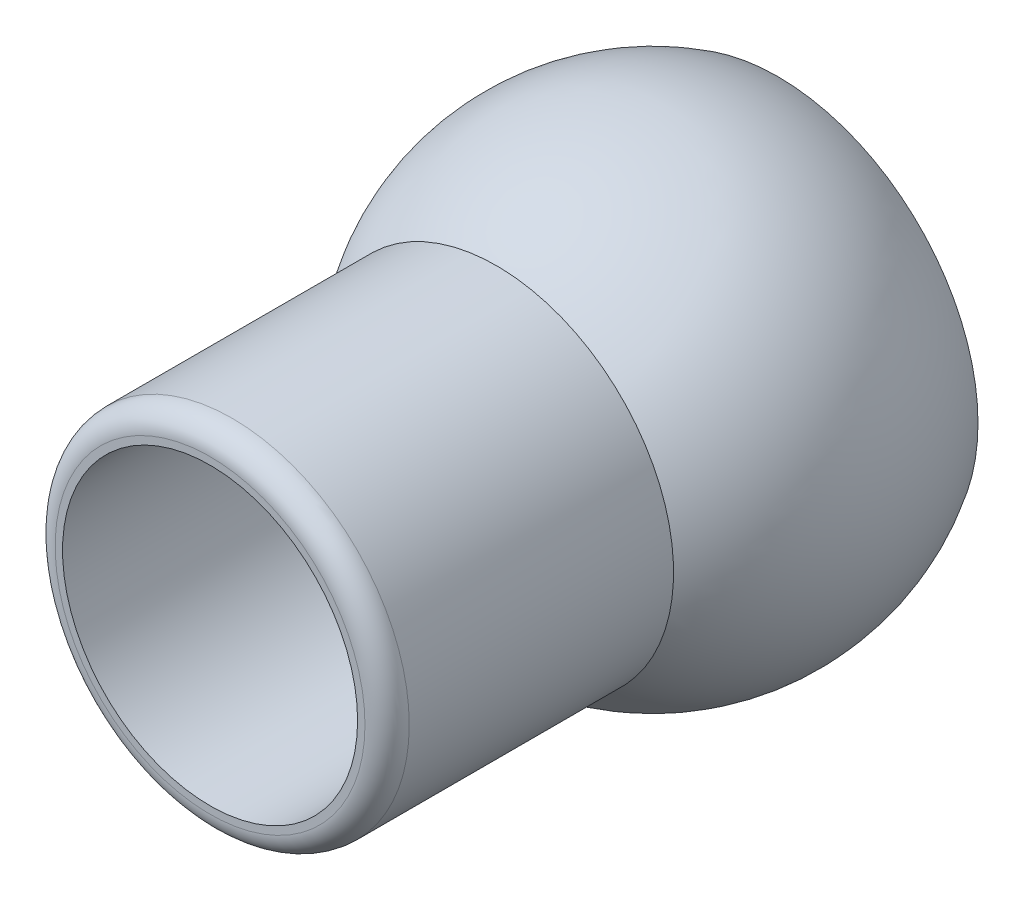
ISO-10303-21;
HEADER;
FILE_DESCRIPTION(('STEP AP214'),'2;1');
FILE_NAME('part.step','',(''),(''),'','','');
FILE_SCHEMA(('AUTOMOTIVE_DESIGN { 1 0 10303 214 1 1 1 1 }'));
ENDSEC;
DATA;
#1=APPLICATION_CONTEXT('core data for automotive mechanical design processes');
#2=APPLICATION_PROTOCOL_DEFINITION('international standard','automotive_design',2000,#1);
#3=PRODUCT_CONTEXT('',#1,'mechanical');
#4=PRODUCT('Part','Part','',(#3));
#5=PRODUCT_RELATED_PRODUCT_CATEGORY('part','',(#4));
#6=PRODUCT_DEFINITION_FORMATION('','',#4);
#7=PRODUCT_DEFINITION_CONTEXT('part definition',#1,'design');
#8=PRODUCT_DEFINITION('design','',#6,#7);
#9=PRODUCT_DEFINITION_SHAPE('','',#8);
#10=(LENGTH_UNIT() NAMED_UNIT(*) SI_UNIT(.MILLI.,.METRE.));
#11=(NAMED_UNIT(*) PLANE_ANGLE_UNIT() SI_UNIT($,.RADIAN.));
#12=(NAMED_UNIT(*) SI_UNIT($,.STERADIAN.) SOLID_ANGLE_UNIT());
#13=UNCERTAINTY_MEASURE_WITH_UNIT(LENGTH_MEASURE(1.E-05),#10,'distance_accuracy_value','');
#14=(GEOMETRIC_REPRESENTATION_CONTEXT(3) GLOBAL_UNCERTAINTY_ASSIGNED_CONTEXT((#13)) GLOBAL_UNIT_ASSIGNED_CONTEXT((#10,
#11,#12)) REPRESENTATION_CONTEXT('',''));
#15=CARTESIAN_POINT('',(0.,0.,0.));
#16=DIRECTION('',(0.,0.,1.));
#17=DIRECTION('',(1.,0.,0.));
#18=AXIS2_PLACEMENT_3D('',#15,#16,#17);
#19=CARTESIAN_POINT('',(0.,0.,0.));
#20=DIRECTION('',(0.,1.,0.));
#21=DIRECTION('',(1.,0.,0.));
#22=AXIS2_PLACEMENT_3D('',#19,#20,#21);
#23=SPHERICAL_SURFACE('',#22,14.);
#24=CARTESIAN_POINT('',(0.,0.,0.));
#25=DIRECTION('',(0.,0.,1.));
#26=DIRECTION('',(1.,0.,0.));
#27=AXIS2_PLACEMENT_3D('',#24,#25,#26);
#28=SPHERICAL_SURFACE('',#27,14.);
#29=CARTESIAN_POINT('',(0.,0.,-6.99066293034368));
#30=DIRECTION('',(0.,0.,1.));
#31=DIRECTION('',(1.,0.,0.));
#32=AXIS2_PLACEMENT_3D('',#29,#30,#31);
#33=CIRCLE('',#32,12.1297416210865);
#34=CARTESIAN_POINT('',(12.1297416210865,0.,-6.99066293034368));
#35=VERTEX_POINT('',#34);
#36=EDGE_CURVE('E40',#35,#35,#33,.F.);
#37=ORIENTED_EDGE('',*,*,#36,.T.);
#38=EDGE_LOOP('',(#37));
#39=FACE_BOUND('',#38,.T.);
#40=CARTESIAN_POINT('',(0.,0.,9.79795897113271));
#41=DIRECTION('',(0.,0.,-1.));
#42=DIRECTION('',(-1.,0.,0.));
#43=AXIS2_PLACEMENT_3D('',#40,#41,#42);
#44=CIRCLE('',#43,10.);
#45=CARTESIAN_POINT('',(-10.,0.,9.79795897113271));
#46=VERTEX_POINT('',#45);
#47=EDGE_CURVE('E53',#46,#46,#44,.T.);
#48=ORIENTED_EDGE('',*,*,#47,.F.);
#49=EDGE_LOOP('',(#48));
#50=FACE_BOUND('',#49,.T.);
#51=ADVANCED_FACE('F33',(#39,#50),#28,.F.);
#52=CARTESIAN_POINT('',(0.,0.,0.));
#53=DIRECTION('',(0.,1.,0.));
#54=DIRECTION('',(1.,0.,0.));
#55=AXIS2_PLACEMENT_3D('',#52,#53,#54);
#56=SPHERICAL_SURFACE('',#55,16.);
#57=CARTESIAN_POINT('',(0.,0.,0.));
#58=DIRECTION('',(0.,0.,-1.));
#59=DIRECTION('',(-1.,0.,0.));
#60=AXIS2_PLACEMENT_3D('',#57,#58,#59);
#61=SPHERICAL_SURFACE('',#60,16.);
#62=CARTESIAN_POINT('',(0.,0.,10.5830052442584));
#63=DIRECTION('',(0.,0.,-1.));
#64=DIRECTION('',(-1.,0.,0.));
#65=AXIS2_PLACEMENT_3D('',#62,#63,#64);
#66=CIRCLE('',#65,12.);
#67=CARTESIAN_POINT('',(-12.,0.,10.5830052442584));
#68=VERTEX_POINT('',#67);
#69=EDGE_CURVE('E57',#68,#68,#66,.F.);
#70=ORIENTED_EDGE('',*,*,#69,.F.);
#71=EDGE_LOOP('',(#70));
#72=FACE_BOUND('',#71,.T.);
#73=CARTESIAN_POINT('',(0.,0.,-8.4899959967968));
#74=DIRECTION('',(0.,0.,-1.));
#75=DIRECTION('',(-1.,0.,0.));
#76=AXIS2_PLACEMENT_3D('',#73,#74,#75);
#77=CIRCLE('',#76,13.5617096257948);
#78=CARTESIAN_POINT('',(-13.5617096257948,0.,-8.4899959967968));
#79=VERTEX_POINT('',#78);
#80=EDGE_CURVE('E51',#79,#79,#77,.T.);
#81=ORIENTED_EDGE('',*,*,#80,.F.);
#82=EDGE_LOOP('',(#81));
#83=FACE_BOUND('',#82,.T.);
#84=ADVANCED_FACE('F69',(#72,#83),#61,.T.);
#85=CARTESIAN_POINT('',(0.,0.,30.));
#86=DIRECTION('',(0.,0.,-1.));
#87=DIRECTION('',(-1.,0.,0.));
#88=AXIS2_PLACEMENT_3D('',#85,#86,#87);
#89=CYLINDRICAL_SURFACE('',#88,10.);
#90=CARTESIAN_POINT('',(0.,0.,30.));
#91=DIRECTION('',(0.,0.,1.));
#92=DIRECTION('',(1.,0.,0.));
#93=AXIS2_PLACEMENT_3D('',#90,#91,#92);
#94=CIRCLE('',#93,10.);
#95=CARTESIAN_POINT('',(10.,0.,30.));
#96=VERTEX_POINT('',#95);
#97=EDGE_CURVE('E60',#96,#96,#94,.T.);
#98=ORIENTED_EDGE('',*,*,#97,.T.);
#99=EDGE_LOOP('',(#98));
#100=FACE_BOUND('',#99,.T.);
#101=ORIENTED_EDGE('',*,*,#47,.T.);
#102=EDGE_LOOP('',(#101));
#103=FACE_BOUND('',#102,.T.);
#104=ADVANCED_FACE('F66',(#100,#103),#89,.F.);
#105=CARTESIAN_POINT('',(0.,0.,30.));
#106=DIRECTION('',(0.,0.,-1.));
#107=DIRECTION('',(-1.,0.,0.));
#108=AXIS2_PLACEMENT_3D('',#105,#106,#107);
#109=CYLINDRICAL_SURFACE('',#108,12.);
#110=CARTESIAN_POINT('',(0.,0.,28.5));
#111=DIRECTION('',(0.,0.,1.));
#112=DIRECTION('',(1.,0.,0.));
#113=AXIS2_PLACEMENT_3D('',#110,#111,#112);
#114=CIRCLE('',#113,12.);
#115=CARTESIAN_POINT('',(12.,0.,28.5));
#116=VERTEX_POINT('',#115);
#117=EDGE_CURVE('E44',#116,#116,#114,.F.);
#118=ORIENTED_EDGE('',*,*,#117,.T.);
#119=EDGE_LOOP('',(#118));
#120=FACE_BOUND('',#119,.T.);
#121=ORIENTED_EDGE('',*,*,#69,.T.);
#122=EDGE_LOOP('',(#121));
#123=FACE_BOUND('',#122,.T.);
#124=ADVANCED_FACE('F77',(#120,#123),#109,.T.);
#125=CARTESIAN_POINT('',(0.,0.,30.));
#126=DIRECTION('',(0.,0.,1.));
#127=DIRECTION('',(1.,0.,0.));
#128=AXIS2_PLACEMENT_3D('',#125,#126,#127);
#129=PLANE('',#128);
#130=CARTESIAN_POINT('',(0.,0.,30.));
#131=DIRECTION('',(0.,0.,1.));
#132=DIRECTION('',(1.,0.,0.));
#133=AXIS2_PLACEMENT_3D('',#130,#131,#132);
#134=CIRCLE('',#133,10.5);
#135=CARTESIAN_POINT('',(10.5,0.,30.));
#136=VERTEX_POINT('',#135);
#137=EDGE_CURVE('E48',#136,#136,#134,.T.);
#138=ORIENTED_EDGE('',*,*,#137,.T.);
#139=EDGE_LOOP('',(#138));
#140=FACE_BOUND('',#139,.T.);
#141=ORIENTED_EDGE('',*,*,#97,.F.);
#142=EDGE_LOOP('',(#141));
#143=FACE_BOUND('',#142,.T.);
#144=ADVANCED_FACE('F82',(#140,#143),#129,.T.);
#145=CARTESIAN_POINT('',(0.,0.,28.5));
#146=DIRECTION('',(0.,0.,1.));
#147=DIRECTION('',(1.,0.,0.));
#148=AXIS2_PLACEMENT_3D('',#145,#146,#147);
#149=TOROIDAL_SURFACE('',#148,10.5,1.5);
#150=ORIENTED_EDGE('',*,*,#117,.F.);
#151=EDGE_LOOP('',(#150));
#152=FACE_BOUND('',#151,.T.);
#153=ORIENTED_EDGE('',*,*,#137,.F.);
#154=EDGE_LOOP('',(#153));
#155=FACE_BOUND('',#154,.T.);
#156=ADVANCED_FACE('F79',(#152,#155),#149,.T.);
#157=CARTESIAN_POINT('',(20.,-14.1385982320727,-8.4899959967968));
#158=DIRECTION('',(0.,0.,-1.));
#159=DIRECTION('',(-1.,0.,0.));
#160=AXIS2_PLACEMENT_3D('',#157,#158,#159);
#161=PLANE('',#160);
#162=CARTESIAN_POINT('',(0.,0.,-8.4899959967968));
#163=DIRECTION('',(0.,0.,-1.));
#164=DIRECTION('',(-1.,0.,0.));
#165=AXIS2_PLACEMENT_3D('',#162,#163,#164);
#166=CIRCLE('',#165,12.9961517368784);
#167=CARTESIAN_POINT('',(-12.9961517368784,0.,-8.4899959967968));
#168=VERTEX_POINT('',#167);
#169=EDGE_CURVE('E10',#168,#168,#166,.F.);
#170=ORIENTED_EDGE('',*,*,#169,.T.);
#171=EDGE_LOOP('',(#170));
#172=FACE_BOUND('',#171,.T.);
#173=ORIENTED_EDGE('',*,*,#80,.T.);
#174=EDGE_LOOP('',(#173));
#175=FACE_BOUND('',#174,.T.);
#176=ADVANCED_FACE('F81',(#172,#175),#161,.T.);
#177=CARTESIAN_POINT('',(0.,0.,-7.4899959967968));
#178=DIRECTION('',(0.,0.,-1.));
#179=DIRECTION('',(-1.,0.,0.));
#180=AXIS2_PLACEMENT_3D('',#177,#178,#179);
#181=TOROIDAL_SURFACE('',#180,12.9961517368784,1.);
#182=ORIENTED_EDGE('',*,*,#169,.F.);
#183=EDGE_LOOP('',(#182));
#184=FACE_BOUND('',#183,.T.);
#185=ORIENTED_EDGE('',*,*,#36,.F.);
#186=EDGE_LOOP('',(#185));
#187=FACE_BOUND('',#186,.T.);
#188=ADVANCED_FACE('F35',(#184,#187),#181,.T.);
#189=CLOSED_SHELL('',(#51,#84,#104,#124,#144,#156,#176,#188));
#190=MANIFOLD_SOLID_BREP('B2',#189);
#191=ADVANCED_BREP_SHAPE_REPRESENTATION('',(#18,#190),#14);
#192=SHAPE_DEFINITION_REPRESENTATION(#9,#191);
ENDSEC;
END-ISO-10303-21;
